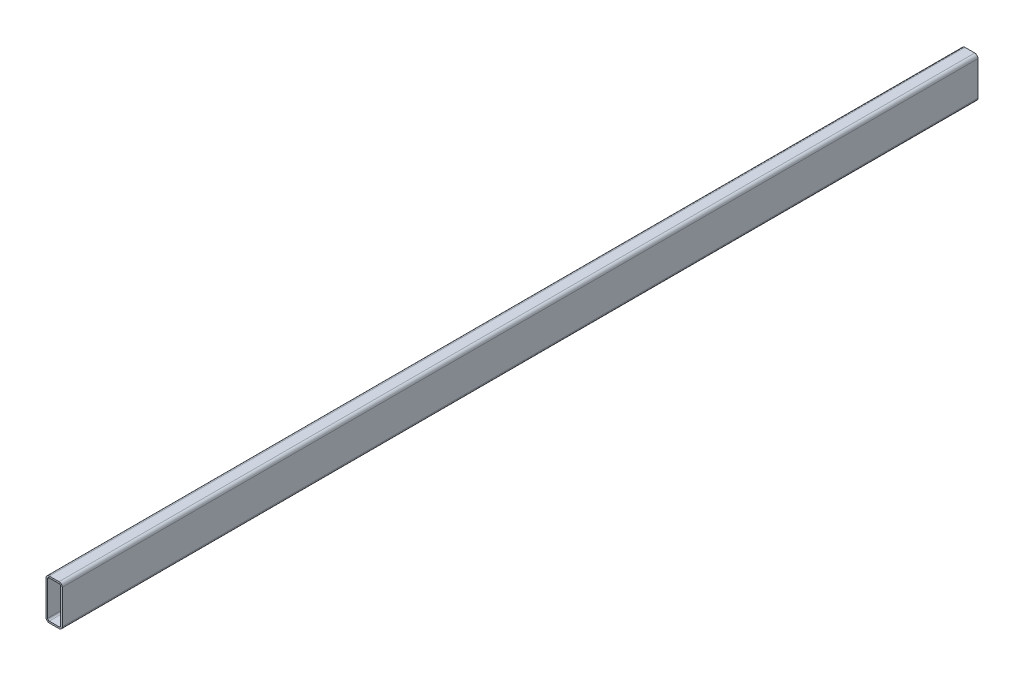
ISO-10303-21;
HEADER;
FILE_DESCRIPTION(('STEP AP214'),'2;1');
FILE_NAME('part.step','',(''),(''),'','','');
FILE_SCHEMA(('AUTOMOTIVE_DESIGN { 1 0 10303 214 1 1 1 1 }'));
ENDSEC;
DATA;
#1=APPLICATION_CONTEXT('core data for automotive mechanical design processes');
#2=APPLICATION_PROTOCOL_DEFINITION('international standard','automotive_design',2000,#1);
#3=PRODUCT_CONTEXT('',#1,'mechanical');
#4=PRODUCT('Part','Part','',(#3));
#5=PRODUCT_RELATED_PRODUCT_CATEGORY('part','',(#4));
#6=PRODUCT_DEFINITION_FORMATION('','',#4);
#7=PRODUCT_DEFINITION_CONTEXT('part definition',#1,'design');
#8=PRODUCT_DEFINITION('design','',#6,#7);
#9=PRODUCT_DEFINITION_SHAPE('','',#8);
#10=(LENGTH_UNIT() NAMED_UNIT(*) SI_UNIT(.MILLI.,.METRE.));
#11=(NAMED_UNIT(*) PLANE_ANGLE_UNIT() SI_UNIT($,.RADIAN.));
#12=(NAMED_UNIT(*) SI_UNIT($,.STERADIAN.) SOLID_ANGLE_UNIT());
#13=UNCERTAINTY_MEASURE_WITH_UNIT(LENGTH_MEASURE(1.E-05),#10,'distance_accuracy_value','');
#14=(GEOMETRIC_REPRESENTATION_CONTEXT(3) GLOBAL_UNCERTAINTY_ASSIGNED_CONTEXT((#13)) GLOBAL_UNIT_ASSIGNED_CONTEXT((#10,
#11,#12)) REPRESENTATION_CONTEXT('',''));
#15=CARTESIAN_POINT('',(0.,0.,0.));
#16=DIRECTION('',(0.,0.,1.));
#17=DIRECTION('',(1.,0.,0.));
#18=AXIS2_PLACEMENT_3D('',#15,#16,#17);
#19=CARTESIAN_POINT('',(-5.99999999999999,21.,562.5));
#20=DIRECTION('',(0.,0.,-1.));
#21=DIRECTION('',(-1.,0.,0.));
#22=AXIS2_PLACEMENT_3D('',#19,#20,#21);
#23=PLANE('',#22);
#24=DIRECTION('',(0.,-1.,0.));
#25=VECTOR('',#24,1.);
#26=CARTESIAN_POINT('',(-9.99999999999999,0.,562.5));
#27=LINE('',#26,#25);
#28=CARTESIAN_POINT('',(-9.99999999999999,21.,562.5));
#29=VERTEX_POINT('',#28);
#30=CARTESIAN_POINT('',(-9.99999999999999,-21.,562.5));
#31=VERTEX_POINT('',#30);
#32=EDGE_CURVE('E215',#29,#31,#27,.T.);
#33=ORIENTED_EDGE('',*,*,#32,.T.);
#34=CARTESIAN_POINT('',(-5.99999999999999,-21.,562.5));
#35=DIRECTION('',(0.,0.,1.));
#36=DIRECTION('',(1.,0.,0.));
#37=AXIS2_PLACEMENT_3D('',#34,#35,#36);
#38=CIRCLE('',#37,4.);
#39=CARTESIAN_POINT('',(-5.99999999999999,-25.,562.5));
#40=VERTEX_POINT('',#39);
#41=EDGE_CURVE('E217',#31,#40,#38,.T.);
#42=ORIENTED_EDGE('',*,*,#41,.T.);
#43=DIRECTION('',(1.,0.,0.));
#44=VECTOR('',#43,1.);
#45=CARTESIAN_POINT('',(-5.99999999999999,-25.,562.5));
#46=LINE('',#45,#44);
#47=CARTESIAN_POINT('',(6.00000000000001,-25.,562.5));
#48=VERTEX_POINT('',#47);
#49=EDGE_CURVE('E220',#40,#48,#46,.T.);
#50=ORIENTED_EDGE('',*,*,#49,.T.);
#51=CARTESIAN_POINT('',(6.,-21.,562.5));
#52=DIRECTION('',(0.,0.,1.));
#53=DIRECTION('',(-1.,0.,0.));
#54=AXIS2_PLACEMENT_3D('',#51,#52,#53);
#55=CIRCLE('',#54,4.);
#56=CARTESIAN_POINT('',(10.,-21.,562.5));
#57=VERTEX_POINT('',#56);
#58=EDGE_CURVE('E222',#48,#57,#55,.T.);
#59=ORIENTED_EDGE('',*,*,#58,.T.);
#60=DIRECTION('',(0.,1.,0.));
#61=VECTOR('',#60,1.);
#62=CARTESIAN_POINT('',(10.,0.,562.5));
#63=LINE('',#62,#61);
#64=CARTESIAN_POINT('',(10.,21.,562.5));
#65=VERTEX_POINT('',#64);
#66=EDGE_CURVE('E224',#57,#65,#63,.T.);
#67=ORIENTED_EDGE('',*,*,#66,.T.);
#68=CARTESIAN_POINT('',(6.,21.,562.5));
#69=DIRECTION('',(0.,0.,1.));
#70=DIRECTION('',(1.,0.,0.));
#71=AXIS2_PLACEMENT_3D('',#68,#69,#70);
#72=CIRCLE('',#71,4.);
#73=CARTESIAN_POINT('',(6.00000000000001,25.,562.5));
#74=VERTEX_POINT('',#73);
#75=EDGE_CURVE('E226',#65,#74,#72,.T.);
#76=ORIENTED_EDGE('',*,*,#75,.T.);
#77=DIRECTION('',(-1.,0.,0.));
#78=VECTOR('',#77,1.);
#79=CARTESIAN_POINT('',(-5.99999999999999,25.,562.5));
#80=LINE('',#79,#78);
#81=CARTESIAN_POINT('',(-5.99999999999999,25.,562.5));
#82=VERTEX_POINT('',#81);
#83=EDGE_CURVE('E228',#74,#82,#80,.T.);
#84=ORIENTED_EDGE('',*,*,#83,.T.);
#85=CARTESIAN_POINT('',(-5.99999999999999,21.,562.5));
#86=DIRECTION('',(0.,0.,1.));
#87=DIRECTION('',(-1.,0.,0.));
#88=AXIS2_PLACEMENT_3D('',#85,#86,#87);
#89=CIRCLE('',#88,4.);
#90=EDGE_CURVE('E230',#82,#29,#89,.T.);
#91=ORIENTED_EDGE('',*,*,#90,.T.);
#92=EDGE_LOOP('',(#33,#42,#50,#59,#67,#76,#84,#91));
#93=FACE_BOUND('',#92,.T.);
#94=DIRECTION('',(0.,-1.,0.));
#95=VECTOR('',#94,1.);
#96=CARTESIAN_POINT('',(-7.99999999999999,0.,562.5));
#97=LINE('',#96,#95);
#98=CARTESIAN_POINT('',(-7.99999999999999,21.,562.5));
#99=VERTEX_POINT('',#98);
#100=CARTESIAN_POINT('',(-7.99999999999999,-21.,562.5));
#101=VERTEX_POINT('',#100);
#102=EDGE_CURVE('E146',#99,#101,#97,.T.);
#103=ORIENTED_EDGE('',*,*,#102,.F.);
#104=CARTESIAN_POINT('',(-5.99999999999999,21.,562.5));
#105=DIRECTION('',(0.,0.,1.));
#106=DIRECTION('',(-1.,0.,0.));
#107=AXIS2_PLACEMENT_3D('',#104,#105,#106);
#108=CIRCLE('',#107,2.);
#109=CARTESIAN_POINT('',(-5.99999999999999,23.,562.5));
#110=VERTEX_POINT('',#109);
#111=EDGE_CURVE('E181',#110,#99,#108,.T.);
#112=ORIENTED_EDGE('',*,*,#111,.F.);
#113=DIRECTION('',(-1.,0.,0.));
#114=VECTOR('',#113,1.);
#115=CARTESIAN_POINT('',(-5.99999999999999,23.,562.5));
#116=LINE('',#115,#114);
#117=CARTESIAN_POINT('',(6.00000000000001,23.,562.5));
#118=VERTEX_POINT('',#117);
#119=EDGE_CURVE('E179',#118,#110,#116,.T.);
#120=ORIENTED_EDGE('',*,*,#119,.F.);
#121=CARTESIAN_POINT('',(6.,21.,562.5));
#122=DIRECTION('',(0.,0.,1.));
#123=DIRECTION('',(1.,0.,0.));
#124=AXIS2_PLACEMENT_3D('',#121,#122,#123);
#125=CIRCLE('',#124,2.);
#126=CARTESIAN_POINT('',(8.00000000000001,21.,562.5));
#127=VERTEX_POINT('',#126);
#128=EDGE_CURVE('E177',#127,#118,#125,.T.);
#129=ORIENTED_EDGE('',*,*,#128,.F.);
#130=DIRECTION('',(0.,1.,0.));
#131=VECTOR('',#130,1.);
#132=CARTESIAN_POINT('',(8.00000000000001,0.,562.5));
#133=LINE('',#132,#131);
#134=CARTESIAN_POINT('',(8.,-21.,562.5));
#135=VERTEX_POINT('',#134);
#136=EDGE_CURVE('E175',#135,#127,#133,.T.);
#137=ORIENTED_EDGE('',*,*,#136,.F.);
#138=CARTESIAN_POINT('',(6.,-21.,562.5));
#139=DIRECTION('',(0.,0.,1.));
#140=DIRECTION('',(-1.,0.,0.));
#141=AXIS2_PLACEMENT_3D('',#138,#139,#140);
#142=CIRCLE('',#141,2.);
#143=CARTESIAN_POINT('',(6.00000000000001,-23.,562.5));
#144=VERTEX_POINT('',#143);
#145=EDGE_CURVE('E171',#144,#135,#142,.T.);
#146=ORIENTED_EDGE('',*,*,#145,.F.);
#147=DIRECTION('',(1.,0.,0.));
#148=VECTOR('',#147,1.);
#149=CARTESIAN_POINT('',(-5.99999999999999,-23.,562.5));
#150=LINE('',#149,#148);
#151=CARTESIAN_POINT('',(-5.99999999999999,-23.,562.5));
#152=VERTEX_POINT('',#151);
#153=EDGE_CURVE('E169',#152,#144,#150,.T.);
#154=ORIENTED_EDGE('',*,*,#153,.F.);
#155=CARTESIAN_POINT('',(-5.99999999999999,-21.,562.5));
#156=DIRECTION('',(0.,0.,1.));
#157=DIRECTION('',(1.,0.,0.));
#158=AXIS2_PLACEMENT_3D('',#155,#156,#157);
#159=CIRCLE('',#158,2.);
#160=EDGE_CURVE('E154',#101,#152,#159,.T.);
#161=ORIENTED_EDGE('',*,*,#160,.F.);
#162=EDGE_LOOP('',(#103,#112,#120,#129,#137,#146,#154,#161));
#163=FACE_BOUND('',#162,.T.);
#164=ADVANCED_FACE('F35',(#93,#163),#23,.F.);
#165=CARTESIAN_POINT('',(-5.99999999999999,21.,-562.5));
#166=DIRECTION('',(0.,0.,-1.));
#167=DIRECTION('',(-1.,0.,0.));
#168=AXIS2_PLACEMENT_3D('',#165,#166,#167);
#169=PLANE('',#168);
#170=DIRECTION('',(0.,-1.,0.));
#171=VECTOR('',#170,1.);
#172=CARTESIAN_POINT('',(-9.99999999999999,0.,-562.5));
#173=LINE('',#172,#171);
#174=CARTESIAN_POINT('',(-9.99999999999999,21.,-562.5));
#175=VERTEX_POINT('',#174);
#176=CARTESIAN_POINT('',(-9.99999999999999,-21.,-562.5));
#177=VERTEX_POINT('',#176);
#178=EDGE_CURVE('E164',#175,#177,#173,.T.);
#179=ORIENTED_EDGE('',*,*,#178,.F.);
#180=CARTESIAN_POINT('',(-5.99999999999999,21.,-562.5));
#181=DIRECTION('',(0.,0.,1.));
#182=DIRECTION('',(-1.,0.,0.));
#183=AXIS2_PLACEMENT_3D('',#180,#181,#182);
#184=CIRCLE('',#183,4.);
#185=CARTESIAN_POINT('',(-5.99999999999999,25.,-562.5));
#186=VERTEX_POINT('',#185);
#187=EDGE_CURVE('E218',#186,#175,#184,.T.);
#188=ORIENTED_EDGE('',*,*,#187,.F.);
#189=DIRECTION('',(-1.,0.,0.));
#190=VECTOR('',#189,1.);
#191=CARTESIAN_POINT('',(-5.99999999999999,25.,-562.5));
#192=LINE('',#191,#190);
#193=CARTESIAN_POINT('',(6.00000000000001,25.,-562.5));
#194=VERTEX_POINT('',#193);
#195=EDGE_CURVE('E246',#194,#186,#192,.T.);
#196=ORIENTED_EDGE('',*,*,#195,.F.);
#197=CARTESIAN_POINT('',(6.,21.,-562.5));
#198=DIRECTION('',(0.,0.,1.));
#199=DIRECTION('',(1.,0.,0.));
#200=AXIS2_PLACEMENT_3D('',#197,#198,#199);
#201=CIRCLE('',#200,4.);
#202=CARTESIAN_POINT('',(10.,21.,-562.5));
#203=VERTEX_POINT('',#202);
#204=EDGE_CURVE('E244',#203,#194,#201,.T.);
#205=ORIENTED_EDGE('',*,*,#204,.F.);
#206=DIRECTION('',(0.,1.,0.));
#207=VECTOR('',#206,1.);
#208=CARTESIAN_POINT('',(10.,0.,-562.5));
#209=LINE('',#208,#207);
#210=CARTESIAN_POINT('',(10.,-21.,-562.5));
#211=VERTEX_POINT('',#210);
#212=EDGE_CURVE('E242',#211,#203,#209,.T.);
#213=ORIENTED_EDGE('',*,*,#212,.F.);
#214=CARTESIAN_POINT('',(6.,-21.,-562.5));
#215=DIRECTION('',(0.,0.,1.));
#216=DIRECTION('',(-1.,0.,0.));
#217=AXIS2_PLACEMENT_3D('',#214,#215,#216);
#218=CIRCLE('',#217,4.);
#219=CARTESIAN_POINT('',(6.00000000000001,-25.,-562.5));
#220=VERTEX_POINT('',#219);
#221=EDGE_CURVE('E239',#220,#211,#218,.T.);
#222=ORIENTED_EDGE('',*,*,#221,.F.);
#223=DIRECTION('',(1.,0.,0.));
#224=VECTOR('',#223,1.);
#225=CARTESIAN_POINT('',(6.00000000000001,-25.,-562.5));
#226=LINE('',#225,#224);
#227=CARTESIAN_POINT('',(-5.99999999999999,-25.,-562.5));
#228=VERTEX_POINT('',#227);
#229=EDGE_CURVE('E237',#228,#220,#226,.T.);
#230=ORIENTED_EDGE('',*,*,#229,.F.);
#231=CARTESIAN_POINT('',(-5.99999999999999,-21.,-562.5));
#232=DIRECTION('',(0.,0.,1.));
#233=DIRECTION('',(1.,0.,0.));
#234=AXIS2_PLACEMENT_3D('',#231,#232,#233);
#235=CIRCLE('',#234,4.);
#236=EDGE_CURVE('E234',#177,#228,#235,.T.);
#237=ORIENTED_EDGE('',*,*,#236,.F.);
#238=EDGE_LOOP('',(#179,#188,#196,#205,#213,#222,#230,#237));
#239=FACE_BOUND('',#238,.T.);
#240=CARTESIAN_POINT('',(-5.99999999999999,21.,-562.5));
#241=DIRECTION('',(0.,0.,1.));
#242=DIRECTION('',(-1.,0.,0.));
#243=AXIS2_PLACEMENT_3D('',#240,#241,#242);
#244=CIRCLE('',#243,2.);
#245=CARTESIAN_POINT('',(-5.99999999999999,23.,-562.5));
#246=VERTEX_POINT('',#245);
#247=CARTESIAN_POINT('',(-7.99999999999999,21.,-562.5));
#248=VERTEX_POINT('',#247);
#249=EDGE_CURVE('E155',#246,#248,#244,.T.);
#250=ORIENTED_EDGE('',*,*,#249,.T.);
#251=DIRECTION('',(0.,-1.,0.));
#252=VECTOR('',#251,1.);
#253=CARTESIAN_POINT('',(-7.99999999999999,0.,-562.5));
#254=LINE('',#253,#252);
#255=CARTESIAN_POINT('',(-7.99999999999999,-21.,-562.5));
#256=VERTEX_POINT('',#255);
#257=EDGE_CURVE('E183',#248,#256,#254,.T.);
#258=ORIENTED_EDGE('',*,*,#257,.T.);
#259=CARTESIAN_POINT('',(-5.99999999999999,-21.,-562.5));
#260=DIRECTION('',(0.,0.,1.));
#261=DIRECTION('',(1.,0.,0.));
#262=AXIS2_PLACEMENT_3D('',#259,#260,#261);
#263=CIRCLE('',#262,2.);
#264=CARTESIAN_POINT('',(-5.99999999999999,-23.,-562.5));
#265=VERTEX_POINT('',#264);
#266=EDGE_CURVE('E162',#256,#265,#263,.T.);
#267=ORIENTED_EDGE('',*,*,#266,.T.);
#268=DIRECTION('',(1.,0.,0.));
#269=VECTOR('',#268,1.);
#270=CARTESIAN_POINT('',(6.00000000000001,-23.,-562.5));
#271=LINE('',#270,#269);
#272=CARTESIAN_POINT('',(6.00000000000001,-23.,-562.5));
#273=VERTEX_POINT('',#272);
#274=EDGE_CURVE('E186',#265,#273,#271,.T.);
#275=ORIENTED_EDGE('',*,*,#274,.T.);
#276=CARTESIAN_POINT('',(6.,-21.,-562.5));
#277=DIRECTION('',(0.,0.,1.));
#278=DIRECTION('',(-1.,0.,0.));
#279=AXIS2_PLACEMENT_3D('',#276,#277,#278);
#280=CIRCLE('',#279,2.);
#281=CARTESIAN_POINT('',(8.,-21.,-562.5));
#282=VERTEX_POINT('',#281);
#283=EDGE_CURVE('E189',#273,#282,#280,.T.);
#284=ORIENTED_EDGE('',*,*,#283,.T.);
#285=DIRECTION('',(0.,1.,0.));
#286=VECTOR('',#285,1.);
#287=CARTESIAN_POINT('',(8.00000000000001,0.,-562.5));
#288=LINE('',#287,#286);
#289=CARTESIAN_POINT('',(8.00000000000001,21.,-562.5));
#290=VERTEX_POINT('',#289);
#291=EDGE_CURVE('E192',#282,#290,#288,.T.);
#292=ORIENTED_EDGE('',*,*,#291,.T.);
#293=CARTESIAN_POINT('',(6.,21.,-562.5));
#294=DIRECTION('',(0.,0.,1.));
#295=DIRECTION('',(1.,0.,0.));
#296=AXIS2_PLACEMENT_3D('',#293,#294,#295);
#297=CIRCLE('',#296,2.);
#298=CARTESIAN_POINT('',(6.00000000000001,23.,-562.5));
#299=VERTEX_POINT('',#298);
#300=EDGE_CURVE('E195',#290,#299,#297,.T.);
#301=ORIENTED_EDGE('',*,*,#300,.T.);
#302=DIRECTION('',(-1.,0.,0.));
#303=VECTOR('',#302,1.);
#304=CARTESIAN_POINT('',(-5.99999999999999,23.,-562.5));
#305=LINE('',#304,#303);
#306=EDGE_CURVE('E198',#299,#246,#305,.T.);
#307=ORIENTED_EDGE('',*,*,#306,.T.);
#308=EDGE_LOOP('',(#250,#258,#267,#275,#284,#292,#301,#307));
#309=FACE_BOUND('',#308,.T.);
#310=ADVANCED_FACE('F278',(#239,#309),#169,.T.);
#311=CARTESIAN_POINT('',(-9.99999999999999,0.,562.5));
#312=DIRECTION('',(1.,0.,0.));
#313=DIRECTION('',(0.,0.,-1.));
#314=AXIS2_PLACEMENT_3D('',#311,#312,#313);
#315=PLANE('',#314);
#316=ORIENTED_EDGE('',*,*,#178,.T.);
#317=DIRECTION('',(0.,0.,-1.));
#318=VECTOR('',#317,1.);
#319=CARTESIAN_POINT('',(-9.99999999999999,-21.,562.5));
#320=LINE('',#319,#318);
#321=EDGE_CURVE('E11',#31,#177,#320,.T.);
#322=ORIENTED_EDGE('',*,*,#321,.F.);
#323=ORIENTED_EDGE('',*,*,#32,.F.);
#324=DIRECTION('',(0.,0.,-1.));
#325=VECTOR('',#324,1.);
#326=CARTESIAN_POINT('',(-9.99999999999999,21.,562.5));
#327=LINE('',#326,#325);
#328=EDGE_CURVE('E232',#29,#175,#327,.T.);
#329=ORIENTED_EDGE('',*,*,#328,.T.);
#330=EDGE_LOOP('',(#316,#322,#323,#329));
#331=FACE_BOUND('',#330,.T.);
#332=ADVANCED_FACE('F37',(#331),#315,.F.);
#333=CARTESIAN_POINT('',(-5.99999999999999,-21.,562.5));
#334=DIRECTION('',(0.,0.,-1.));
#335=DIRECTION('',(-1.,0.,0.));
#336=AXIS2_PLACEMENT_3D('',#333,#334,#335);
#337=CYLINDRICAL_SURFACE('',#336,4.);
#338=ORIENTED_EDGE('',*,*,#236,.T.);
#339=DIRECTION('',(0.,0.,-1.));
#340=VECTOR('',#339,1.);
#341=CARTESIAN_POINT('',(-5.99999999999999,-25.,562.5));
#342=LINE('',#341,#340);
#343=EDGE_CURVE('E43',#40,#228,#342,.T.);
#344=ORIENTED_EDGE('',*,*,#343,.F.);
#345=ORIENTED_EDGE('',*,*,#41,.F.);
#346=ORIENTED_EDGE('',*,*,#321,.T.);
#347=EDGE_LOOP('',(#338,#344,#345,#346));
#348=FACE_BOUND('',#347,.T.);
#349=ADVANCED_FACE('F274',(#348),#337,.T.);
#350=CARTESIAN_POINT('',(6.00000000000001,-25.,562.5));
#351=DIRECTION('',(0.,1.,0.));
#352=DIRECTION('',(-1.,0.,0.));
#353=AXIS2_PLACEMENT_3D('',#350,#351,#352);
#354=PLANE('',#353);
#355=ORIENTED_EDGE('',*,*,#229,.T.);
#356=DIRECTION('',(0.,0.,-1.));
#357=VECTOR('',#356,1.);
#358=CARTESIAN_POINT('',(6.00000000000001,-25.,562.5));
#359=LINE('',#358,#357);
#360=EDGE_CURVE('E264',#48,#220,#359,.T.);
#361=ORIENTED_EDGE('',*,*,#360,.F.);
#362=ORIENTED_EDGE('',*,*,#49,.F.);
#363=ORIENTED_EDGE('',*,*,#343,.T.);
#364=EDGE_LOOP('',(#355,#361,#362,#363));
#365=FACE_BOUND('',#364,.T.);
#366=ADVANCED_FACE('F270',(#365),#354,.F.);
#367=CARTESIAN_POINT('',(6.,-21.,562.5));
#368=DIRECTION('',(0.,0.,-1.));
#369=DIRECTION('',(-1.,0.,0.));
#370=AXIS2_PLACEMENT_3D('',#367,#368,#369);
#371=CYLINDRICAL_SURFACE('',#370,4.);
#372=ORIENTED_EDGE('',*,*,#221,.T.);
#373=DIRECTION('',(0.,0.,-1.));
#374=VECTOR('',#373,1.);
#375=CARTESIAN_POINT('',(10.,-21.,562.5));
#376=LINE('',#375,#374);
#377=EDGE_CURVE('E261',#57,#211,#376,.T.);
#378=ORIENTED_EDGE('',*,*,#377,.F.);
#379=ORIENTED_EDGE('',*,*,#58,.F.);
#380=ORIENTED_EDGE('',*,*,#360,.T.);
#381=EDGE_LOOP('',(#372,#378,#379,#380));
#382=FACE_BOUND('',#381,.T.);
#383=ADVANCED_FACE('F285',(#382),#371,.T.);
#384=CARTESIAN_POINT('',(10.,0.,562.5));
#385=DIRECTION('',(-1.,0.,0.));
#386=DIRECTION('',(0.,-1.,0.));
#387=AXIS2_PLACEMENT_3D('',#384,#385,#386);
#388=PLANE('',#387);
#389=ORIENTED_EDGE('',*,*,#212,.T.);
#390=DIRECTION('',(0.,0.,-1.));
#391=VECTOR('',#390,1.);
#392=CARTESIAN_POINT('',(10.,21.,562.5));
#393=LINE('',#392,#391);
#394=EDGE_CURVE('E258',#65,#203,#393,.T.);
#395=ORIENTED_EDGE('',*,*,#394,.F.);
#396=ORIENTED_EDGE('',*,*,#66,.F.);
#397=ORIENTED_EDGE('',*,*,#377,.T.);
#398=EDGE_LOOP('',(#389,#395,#396,#397));
#399=FACE_BOUND('',#398,.T.);
#400=ADVANCED_FACE('F289',(#399),#388,.F.);
#401=CARTESIAN_POINT('',(6.,21.,562.5));
#402=DIRECTION('',(0.,0.,-1.));
#403=DIRECTION('',(-1.,0.,0.));
#404=AXIS2_PLACEMENT_3D('',#401,#402,#403);
#405=CYLINDRICAL_SURFACE('',#404,4.);
#406=ORIENTED_EDGE('',*,*,#204,.T.);
#407=DIRECTION('',(0.,0.,-1.));
#408=VECTOR('',#407,1.);
#409=CARTESIAN_POINT('',(6.00000000000001,25.,562.5));
#410=LINE('',#409,#408);
#411=EDGE_CURVE('E255',#74,#194,#410,.T.);
#412=ORIENTED_EDGE('',*,*,#411,.F.);
#413=ORIENTED_EDGE('',*,*,#75,.F.);
#414=ORIENTED_EDGE('',*,*,#394,.T.);
#415=EDGE_LOOP('',(#406,#412,#413,#414));
#416=FACE_BOUND('',#415,.T.);
#417=ADVANCED_FACE('F306',(#416),#405,.T.);
#418=CARTESIAN_POINT('',(-5.99999999999999,25.,562.5));
#419=DIRECTION('',(0.,-1.,0.));
#420=DIRECTION('',(0.,0.,-1.));
#421=AXIS2_PLACEMENT_3D('',#418,#419,#420);
#422=PLANE('',#421);
#423=ORIENTED_EDGE('',*,*,#195,.T.);
#424=DIRECTION('',(0.,0.,-1.));
#425=VECTOR('',#424,1.);
#426=CARTESIAN_POINT('',(-5.99999999999999,25.,562.5));
#427=LINE('',#426,#425);
#428=EDGE_CURVE('E252',#82,#186,#427,.T.);
#429=ORIENTED_EDGE('',*,*,#428,.F.);
#430=ORIENTED_EDGE('',*,*,#83,.F.);
#431=ORIENTED_EDGE('',*,*,#411,.T.);
#432=EDGE_LOOP('',(#423,#429,#430,#431));
#433=FACE_BOUND('',#432,.T.);
#434=ADVANCED_FACE('F303',(#433),#422,.F.);
#435=CARTESIAN_POINT('',(-5.99999999999999,21.,562.5));
#436=DIRECTION('',(0.,0.,-1.));
#437=DIRECTION('',(-1.,0.,0.));
#438=AXIS2_PLACEMENT_3D('',#435,#436,#437);
#439=CYLINDRICAL_SURFACE('',#438,4.);
#440=ORIENTED_EDGE('',*,*,#187,.T.);
#441=ORIENTED_EDGE('',*,*,#328,.F.);
#442=ORIENTED_EDGE('',*,*,#90,.F.);
#443=ORIENTED_EDGE('',*,*,#428,.T.);
#444=EDGE_LOOP('',(#440,#441,#442,#443));
#445=FACE_BOUND('',#444,.T.);
#446=ADVANCED_FACE('F299',(#445),#439,.T.);
#447=CARTESIAN_POINT('',(-7.99999999999999,0.,562.5));
#448=DIRECTION('',(1.,0.,0.));
#449=DIRECTION('',(0.,0.,-1.));
#450=AXIS2_PLACEMENT_3D('',#447,#448,#449);
#451=PLANE('',#450);
#452=ORIENTED_EDGE('',*,*,#257,.F.);
#453=DIRECTION('',(0.,0.,-1.));
#454=VECTOR('',#453,1.);
#455=CARTESIAN_POINT('',(-7.99999999999999,21.,562.5));
#456=LINE('',#455,#454);
#457=EDGE_CURVE('E55',#99,#248,#456,.T.);
#458=ORIENTED_EDGE('',*,*,#457,.F.);
#459=ORIENTED_EDGE('',*,*,#102,.T.);
#460=DIRECTION('',(0.,0.,-1.));
#461=VECTOR('',#460,1.);
#462=CARTESIAN_POINT('',(-7.99999999999999,-21.,562.5));
#463=LINE('',#462,#461);
#464=EDGE_CURVE('E149',#101,#256,#463,.T.);
#465=ORIENTED_EDGE('',*,*,#464,.T.);
#466=EDGE_LOOP('',(#452,#458,#459,#465));
#467=FACE_BOUND('',#466,.T.);
#468=ADVANCED_FACE('F148',(#467),#451,.T.);
#469=CARTESIAN_POINT('',(-5.99999999999999,-21.,562.5));
#470=DIRECTION('',(0.,0.,-1.));
#471=DIRECTION('',(-1.,0.,0.));
#472=AXIS2_PLACEMENT_3D('',#469,#470,#471);
#473=CYLINDRICAL_SURFACE('',#472,2.);
#474=ORIENTED_EDGE('',*,*,#266,.F.);
#475=ORIENTED_EDGE('',*,*,#464,.F.);
#476=ORIENTED_EDGE('',*,*,#160,.T.);
#477=DIRECTION('',(0.,0.,-1.));
#478=VECTOR('',#477,1.);
#479=CARTESIAN_POINT('',(-5.99999999999999,-23.,562.5));
#480=LINE('',#479,#478);
#481=EDGE_CURVE('E165',#152,#265,#480,.T.);
#482=ORIENTED_EDGE('',*,*,#481,.T.);
#483=EDGE_LOOP('',(#474,#475,#476,#482));
#484=FACE_BOUND('',#483,.T.);
#485=ADVANCED_FACE('F158',(#484),#473,.F.);
#486=CARTESIAN_POINT('',(6.00000000000001,-23.,562.5));
#487=DIRECTION('',(0.,1.,0.));
#488=DIRECTION('',(0.,0.,1.));
#489=AXIS2_PLACEMENT_3D('',#486,#487,#488);
#490=PLANE('',#489);
#491=ORIENTED_EDGE('',*,*,#274,.F.);
#492=ORIENTED_EDGE('',*,*,#481,.F.);
#493=ORIENTED_EDGE('',*,*,#153,.T.);
#494=DIRECTION('',(0.,0.,-1.));
#495=VECTOR('',#494,1.);
#496=CARTESIAN_POINT('',(6.00000000000001,-23.,562.5));
#497=LINE('',#496,#495);
#498=EDGE_CURVE('E212',#144,#273,#497,.T.);
#499=ORIENTED_EDGE('',*,*,#498,.T.);
#500=EDGE_LOOP('',(#491,#492,#493,#499));
#501=FACE_BOUND('',#500,.T.);
#502=ADVANCED_FACE('F331',(#501),#490,.T.);
#503=CARTESIAN_POINT('',(6.,-21.,562.5));
#504=DIRECTION('',(0.,0.,-1.));
#505=DIRECTION('',(-1.,0.,0.));
#506=AXIS2_PLACEMENT_3D('',#503,#504,#505);
#507=CYLINDRICAL_SURFACE('',#506,2.);
#508=ORIENTED_EDGE('',*,*,#283,.F.);
#509=ORIENTED_EDGE('',*,*,#498,.F.);
#510=ORIENTED_EDGE('',*,*,#145,.T.);
#511=DIRECTION('',(0.,0.,-1.));
#512=VECTOR('',#511,1.);
#513=CARTESIAN_POINT('',(8.,-21.,562.5));
#514=LINE('',#513,#512);
#515=EDGE_CURVE('E209',#135,#282,#514,.T.);
#516=ORIENTED_EDGE('',*,*,#515,.T.);
#517=EDGE_LOOP('',(#508,#509,#510,#516));
#518=FACE_BOUND('',#517,.T.);
#519=ADVANCED_FACE('F335',(#518),#507,.F.);
#520=CARTESIAN_POINT('',(8.00000000000001,0.,562.5));
#521=DIRECTION('',(-1.,0.,0.));
#522=DIRECTION('',(0.,0.,1.));
#523=AXIS2_PLACEMENT_3D('',#520,#521,#522);
#524=PLANE('',#523);
#525=ORIENTED_EDGE('',*,*,#291,.F.);
#526=ORIENTED_EDGE('',*,*,#515,.F.);
#527=ORIENTED_EDGE('',*,*,#136,.T.);
#528=DIRECTION('',(0.,0.,-1.));
#529=VECTOR('',#528,1.);
#530=CARTESIAN_POINT('',(8.00000000000001,21.,562.5));
#531=LINE('',#530,#529);
#532=EDGE_CURVE('E207',#127,#290,#531,.T.);
#533=ORIENTED_EDGE('',*,*,#532,.T.);
#534=EDGE_LOOP('',(#525,#526,#527,#533));
#535=FACE_BOUND('',#534,.T.);
#536=ADVANCED_FACE('F341',(#535),#524,.T.);
#537=CARTESIAN_POINT('',(6.,21.,562.5));
#538=DIRECTION('',(0.,0.,-1.));
#539=DIRECTION('',(-1.,0.,0.));
#540=AXIS2_PLACEMENT_3D('',#537,#538,#539);
#541=CYLINDRICAL_SURFACE('',#540,2.);
#542=ORIENTED_EDGE('',*,*,#300,.F.);
#543=ORIENTED_EDGE('',*,*,#532,.F.);
#544=ORIENTED_EDGE('',*,*,#128,.T.);
#545=DIRECTION('',(0.,0.,-1.));
#546=VECTOR('',#545,1.);
#547=CARTESIAN_POINT('',(6.00000000000001,23.,562.5));
#548=LINE('',#547,#546);
#549=EDGE_CURVE('E205',#118,#299,#548,.T.);
#550=ORIENTED_EDGE('',*,*,#549,.T.);
#551=EDGE_LOOP('',(#542,#543,#544,#550));
#552=FACE_BOUND('',#551,.T.);
#553=ADVANCED_FACE('F345',(#552),#541,.F.);
#554=CARTESIAN_POINT('',(-5.99999999999999,23.,562.5));
#555=DIRECTION('',(0.,-1.,0.));
#556=DIRECTION('',(1.,0.,0.));
#557=AXIS2_PLACEMENT_3D('',#554,#555,#556);
#558=PLANE('',#557);
#559=ORIENTED_EDGE('',*,*,#306,.F.);
#560=ORIENTED_EDGE('',*,*,#549,.F.);
#561=ORIENTED_EDGE('',*,*,#119,.T.);
#562=DIRECTION('',(0.,0.,-1.));
#563=VECTOR('',#562,1.);
#564=CARTESIAN_POINT('',(-5.99999999999999,23.,562.5));
#565=LINE('',#564,#563);
#566=EDGE_CURVE('E50',#110,#246,#565,.T.);
#567=ORIENTED_EDGE('',*,*,#566,.T.);
#568=EDGE_LOOP('',(#559,#560,#561,#567));
#569=FACE_BOUND('',#568,.T.);
#570=ADVANCED_FACE('F349',(#569),#558,.T.);
#571=CARTESIAN_POINT('',(-5.99999999999999,21.,562.5));
#572=DIRECTION('',(0.,0.,-1.));
#573=DIRECTION('',(-1.,0.,0.));
#574=AXIS2_PLACEMENT_3D('',#571,#572,#573);
#575=CYLINDRICAL_SURFACE('',#574,2.);
#576=ORIENTED_EDGE('',*,*,#249,.F.);
#577=ORIENTED_EDGE('',*,*,#566,.F.);
#578=ORIENTED_EDGE('',*,*,#111,.T.);
#579=ORIENTED_EDGE('',*,*,#457,.T.);
#580=EDGE_LOOP('',(#576,#577,#578,#579));
#581=FACE_BOUND('',#580,.T.);
#582=ADVANCED_FACE('F353',(#581),#575,.F.);
#583=CLOSED_SHELL('',(#164,#310,#332,#349,#366,#383,#400,#417,#434,#446,#468,#485,#502,#519,
#536,#553,#570,#582));
#584=MANIFOLD_SOLID_BREP('B2',#583);
#585=ADVANCED_BREP_SHAPE_REPRESENTATION('',(#18,#584),#14);
#586=SHAPE_DEFINITION_REPRESENTATION(#9,#585);
ENDSEC;
END-ISO-10303-21;
